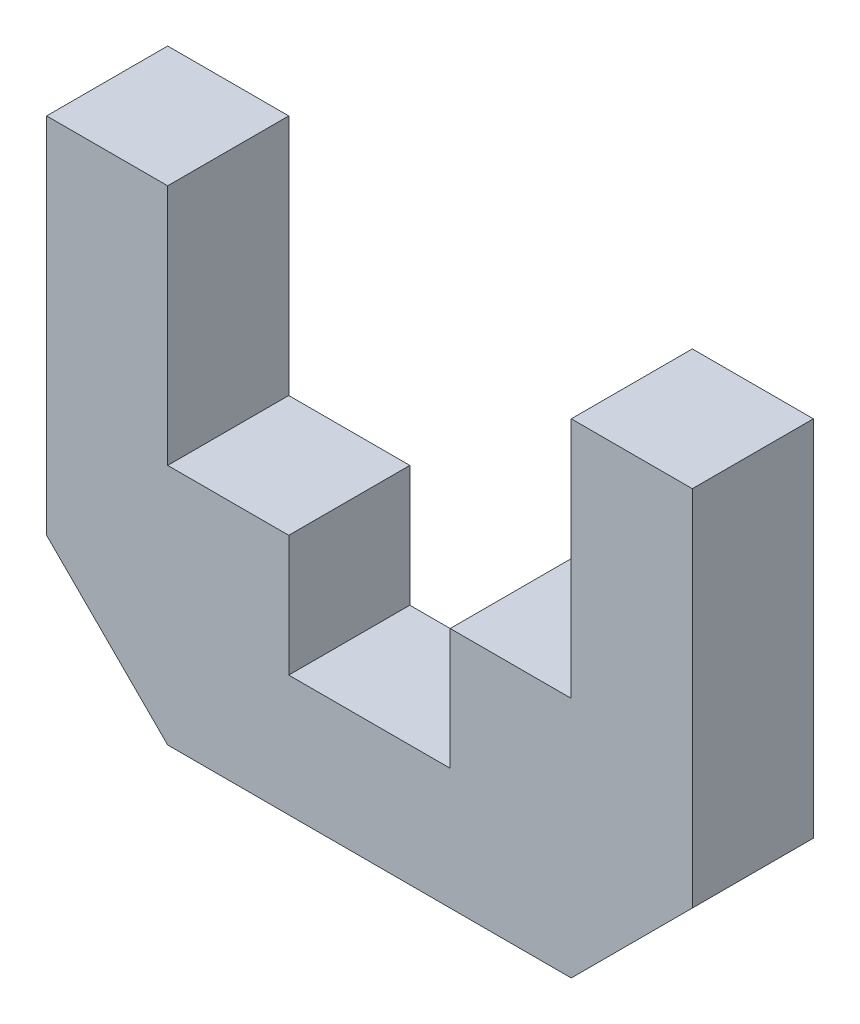
ISO-10303-21;
HEADER;
FILE_DESCRIPTION(('STEP AP214'),'2;1');
FILE_NAME('part.step','',(''),(''),'','','');
FILE_SCHEMA(('AUTOMOTIVE_DESIGN { 1 0 10303 214 1 1 1 1 }'));
ENDSEC;
DATA;
#1=APPLICATION_CONTEXT('core data for automotive mechanical design processes');
#2=APPLICATION_PROTOCOL_DEFINITION('international standard','automotive_design',2000,#1);
#3=PRODUCT_CONTEXT('',#1,'mechanical');
#4=PRODUCT('Part','Part','',(#3));
#5=PRODUCT_RELATED_PRODUCT_CATEGORY('part','',(#4));
#6=PRODUCT_DEFINITION_FORMATION('','',#4);
#7=PRODUCT_DEFINITION_CONTEXT('part definition',#1,'design');
#8=PRODUCT_DEFINITION('design','',#6,#7);
#9=PRODUCT_DEFINITION_SHAPE('','',#8);
#10=(LENGTH_UNIT() NAMED_UNIT(*) SI_UNIT(.MILLI.,.METRE.));
#11=(NAMED_UNIT(*) PLANE_ANGLE_UNIT() SI_UNIT($,.RADIAN.));
#12=(NAMED_UNIT(*) SI_UNIT($,.STERADIAN.) SOLID_ANGLE_UNIT());
#13=UNCERTAINTY_MEASURE_WITH_UNIT(LENGTH_MEASURE(1.E-05),#10,'distance_accuracy_value','');
#14=(GEOMETRIC_REPRESENTATION_CONTEXT(3) GLOBAL_UNCERTAINTY_ASSIGNED_CONTEXT((#13)) GLOBAL_UNIT_ASSIGNED_CONTEXT((#10,
#11,#12)) REPRESENTATION_CONTEXT('',''));
#15=CARTESIAN_POINT('',(0.,0.,0.));
#16=DIRECTION('',(0.,0.,1.));
#17=DIRECTION('',(1.,0.,0.));
#18=AXIS2_PLACEMENT_3D('',#15,#16,#17);
#19=CARTESIAN_POINT('',(-2.,3.,3.));
#20=DIRECTION('',(0.,-1.,0.));
#21=DIRECTION('',(0.,0.,-1.));
#22=AXIS2_PLACEMENT_3D('',#19,#20,#21);
#23=PLANE('',#22);
#24=DIRECTION('',(-1.,0.,0.));
#25=VECTOR('',#24,1.);
#26=CARTESIAN_POINT('',(-2.,3.,0.));
#27=LINE('',#26,#25);
#28=CARTESIAN_POINT('',(-2.,3.,0.));
#29=VERTEX_POINT('',#28);
#30=CARTESIAN_POINT('',(-5.,3.,0.));
#31=VERTEX_POINT('',#30);
#32=EDGE_CURVE('E171',#29,#31,#27,.T.);
#33=ORIENTED_EDGE('',*,*,#32,.T.);
#34=DIRECTION('',(0.,0.,-1.));
#35=VECTOR('',#34,1.);
#36=CARTESIAN_POINT('',(-5.,3.,3.));
#37=LINE('',#36,#35);
#38=CARTESIAN_POINT('',(-5.,3.,3.));
#39=VERTEX_POINT('',#38);
#40=EDGE_CURVE('E11',#39,#31,#37,.T.);
#41=ORIENTED_EDGE('',*,*,#40,.F.);
#42=DIRECTION('',(-1.,0.,0.));
#43=VECTOR('',#42,1.);
#44=CARTESIAN_POINT('',(-2.,3.,3.));
#45=LINE('',#44,#43);
#46=CARTESIAN_POINT('',(-2.,3.,3.));
#47=VERTEX_POINT('',#46);
#48=EDGE_CURVE('E197',#47,#39,#45,.T.);
#49=ORIENTED_EDGE('',*,*,#48,.F.);
#50=DIRECTION('',(0.,0.,-1.));
#51=VECTOR('',#50,1.);
#52=CARTESIAN_POINT('',(-2.,3.,3.));
#53=LINE('',#52,#51);
#54=EDGE_CURVE('E167',#47,#29,#53,.T.);
#55=ORIENTED_EDGE('',*,*,#54,.T.);
#56=EDGE_LOOP('',(#33,#41,#49,#55));
#57=FACE_BOUND('',#56,.T.);
#58=ADVANCED_FACE('F39',(#57),#23,.F.);
#59=CARTESIAN_POINT('',(-5.,3.,3.));
#60=DIRECTION('',(-1.,0.,0.));
#61=DIRECTION('',(0.,0.,1.));
#62=AXIS2_PLACEMENT_3D('',#59,#60,#61);
#63=PLANE('',#62);
#64=DIRECTION('',(0.,1.,0.));
#65=VECTOR('',#64,1.);
#66=CARTESIAN_POINT('',(-5.,3.,0.));
#67=LINE('',#66,#65);
#68=CARTESIAN_POINT('',(-5.,9.,0.));
#69=VERTEX_POINT('',#68);
#70=EDGE_CURVE('E174',#31,#69,#67,.T.);
#71=ORIENTED_EDGE('',*,*,#70,.T.);
#72=DIRECTION('',(0.,0.,-1.));
#73=VECTOR('',#72,1.);
#74=CARTESIAN_POINT('',(-5.,9.,3.));
#75=LINE('',#74,#73);
#76=CARTESIAN_POINT('',(-5.,9.,3.));
#77=VERTEX_POINT('',#76);
#78=EDGE_CURVE('E47',#77,#69,#75,.T.);
#79=ORIENTED_EDGE('',*,*,#78,.F.);
#80=DIRECTION('',(0.,1.,0.));
#81=VECTOR('',#80,1.);
#82=CARTESIAN_POINT('',(-5.,3.,3.));
#83=LINE('',#82,#81);
#84=EDGE_CURVE('E116',#39,#77,#83,.T.);
#85=ORIENTED_EDGE('',*,*,#84,.F.);
#86=ORIENTED_EDGE('',*,*,#40,.T.);
#87=EDGE_LOOP('',(#71,#79,#85,#86));
#88=FACE_BOUND('',#87,.T.);
#89=ADVANCED_FACE('F285',(#88),#63,.F.);
#90=CARTESIAN_POINT('',(-5.,9.,3.));
#91=DIRECTION('',(0.,-1.,0.));
#92=DIRECTION('',(0.,0.,-1.));
#93=AXIS2_PLACEMENT_3D('',#90,#91,#92);
#94=PLANE('',#93);
#95=DIRECTION('',(-1.,0.,0.));
#96=VECTOR('',#95,1.);
#97=CARTESIAN_POINT('',(-5.,9.,0.));
#98=LINE('',#97,#96);
#99=CARTESIAN_POINT('',(-8.,9.,0.));
#100=VERTEX_POINT('',#99);
#101=EDGE_CURVE('E176',#69,#100,#98,.T.);
#102=ORIENTED_EDGE('',*,*,#101,.T.);
#103=DIRECTION('',(0.,0.,-1.));
#104=VECTOR('',#103,1.);
#105=CARTESIAN_POINT('',(-8.,9.,3.));
#106=LINE('',#105,#104);
#107=CARTESIAN_POINT('',(-8.,9.,3.));
#108=VERTEX_POINT('',#107);
#109=EDGE_CURVE('E222',#108,#100,#106,.T.);
#110=ORIENTED_EDGE('',*,*,#109,.F.);
#111=DIRECTION('',(-1.,0.,0.));
#112=VECTOR('',#111,1.);
#113=CARTESIAN_POINT('',(-5.,9.,3.));
#114=LINE('',#113,#112);
#115=EDGE_CURVE('E230',#77,#108,#114,.T.);
#116=ORIENTED_EDGE('',*,*,#115,.F.);
#117=ORIENTED_EDGE('',*,*,#78,.T.);
#118=EDGE_LOOP('',(#102,#110,#116,#117));
#119=FACE_BOUND('',#118,.T.);
#120=ADVANCED_FACE('F228',(#119),#94,.F.);
#121=CARTESIAN_POINT('',(-8.,9.,3.));
#122=DIRECTION('',(1.,0.,0.));
#123=DIRECTION('',(0.,0.,-1.));
#124=AXIS2_PLACEMENT_3D('',#121,#122,#123);
#125=PLANE('',#124);
#126=DIRECTION('',(0.,-1.,0.));
#127=VECTOR('',#126,1.);
#128=CARTESIAN_POINT('',(-8.,9.,0.));
#129=LINE('',#128,#127);
#130=CARTESIAN_POINT('',(-8.,0.,0.));
#131=VERTEX_POINT('',#130);
#132=EDGE_CURVE('E178',#100,#131,#129,.T.);
#133=ORIENTED_EDGE('',*,*,#132,.T.);
#134=DIRECTION('',(0.,0.,-1.));
#135=VECTOR('',#134,1.);
#136=CARTESIAN_POINT('',(-8.,0.,3.));
#137=LINE('',#136,#135);
#138=CARTESIAN_POINT('',(-8.,0.,3.));
#139=VERTEX_POINT('',#138);
#140=EDGE_CURVE('E219',#139,#131,#137,.T.);
#141=ORIENTED_EDGE('',*,*,#140,.F.);
#142=DIRECTION('',(0.,-1.,0.));
#143=VECTOR('',#142,1.);
#144=CARTESIAN_POINT('',(-8.,9.,3.));
#145=LINE('',#144,#143);
#146=EDGE_CURVE('E248',#108,#139,#145,.T.);
#147=ORIENTED_EDGE('',*,*,#146,.F.);
#148=ORIENTED_EDGE('',*,*,#109,.T.);
#149=EDGE_LOOP('',(#133,#141,#147,#148));
#150=FACE_BOUND('',#149,.T.);
#151=ADVANCED_FACE('F239',(#150),#125,.F.);
#152=CARTESIAN_POINT('',(-5.,-3.,3.));
#153=DIRECTION('',(0.707106781186547,0.707106781186548,0.));
#154=DIRECTION('',(-0.707106781186548,0.707106781186547,0.));
#155=AXIS2_PLACEMENT_3D('',#152,#153,#154);
#156=PLANE('',#155);
#157=DIRECTION('',(0.707106781186548,-0.707106781186547,0.));
#158=VECTOR('',#157,1.);
#159=CARTESIAN_POINT('',(-5.,-3.,0.));
#160=LINE('',#159,#158);
#161=CARTESIAN_POINT('',(-5.,-3.,0.));
#162=VERTEX_POINT('',#161);
#163=EDGE_CURVE('E180',#131,#162,#160,.T.);
#164=ORIENTED_EDGE('',*,*,#163,.T.);
#165=DIRECTION('',(0.,0.,-1.));
#166=VECTOR('',#165,1.);
#167=CARTESIAN_POINT('',(-5.,-3.,3.));
#168=LINE('',#167,#166);
#169=CARTESIAN_POINT('',(-5.,-3.,3.));
#170=VERTEX_POINT('',#169);
#171=EDGE_CURVE('E216',#170,#162,#168,.T.);
#172=ORIENTED_EDGE('',*,*,#171,.F.);
#173=DIRECTION('',(0.707106781186548,-0.707106781186547,0.));
#174=VECTOR('',#173,1.);
#175=CARTESIAN_POINT('',(-5.,-3.,3.));
#176=LINE('',#175,#174);
#177=EDGE_CURVE('E245',#139,#170,#176,.T.);
#178=ORIENTED_EDGE('',*,*,#177,.F.);
#179=ORIENTED_EDGE('',*,*,#140,.T.);
#180=EDGE_LOOP('',(#164,#172,#178,#179));
#181=FACE_BOUND('',#180,.T.);
#182=ADVANCED_FACE('F243',(#181),#156,.F.);
#183=CARTESIAN_POINT('',(5.,-3.,3.));
#184=DIRECTION('',(0.,1.,0.));
#185=DIRECTION('',(0.,0.,1.));
#186=AXIS2_PLACEMENT_3D('',#183,#184,#185);
#187=PLANE('',#186);
#188=DIRECTION('',(1.,0.,0.));
#189=VECTOR('',#188,1.);
#190=CARTESIAN_POINT('',(5.,-3.,0.));
#191=LINE('',#190,#189);
#192=CARTESIAN_POINT('',(5.,-3.,0.));
#193=VERTEX_POINT('',#192);
#194=EDGE_CURVE('E182',#162,#193,#191,.T.);
#195=ORIENTED_EDGE('',*,*,#194,.T.);
#196=DIRECTION('',(0.,0.,-1.));
#197=VECTOR('',#196,1.);
#198=CARTESIAN_POINT('',(5.,-3.,3.));
#199=LINE('',#198,#197);
#200=CARTESIAN_POINT('',(5.,-3.,3.));
#201=VERTEX_POINT('',#200);
#202=EDGE_CURVE('E213',#201,#193,#199,.T.);
#203=ORIENTED_EDGE('',*,*,#202,.F.);
#204=DIRECTION('',(1.,0.,0.));
#205=VECTOR('',#204,1.);
#206=CARTESIAN_POINT('',(5.,-3.,3.));
#207=LINE('',#206,#205);
#208=EDGE_CURVE('E247',#170,#201,#207,.T.);
#209=ORIENTED_EDGE('',*,*,#208,.F.);
#210=ORIENTED_EDGE('',*,*,#171,.T.);
#211=EDGE_LOOP('',(#195,#203,#209,#210));
#212=FACE_BOUND('',#211,.T.);
#213=ADVANCED_FACE('F298',(#212),#187,.F.);
#214=CARTESIAN_POINT('',(5.,-3.,3.));
#215=DIRECTION('',(-0.707106781186547,0.707106781186548,0.));
#216=DIRECTION('',(-0.707106781186548,-0.707106781186547,0.));
#217=AXIS2_PLACEMENT_3D('',#214,#215,#216);
#218=PLANE('',#217);
#219=DIRECTION('',(0.707106781186548,0.707106781186547,0.));
#220=VECTOR('',#219,1.);
#221=CARTESIAN_POINT('',(5.,-3.,0.));
#222=LINE('',#221,#220);
#223=CARTESIAN_POINT('',(8.,0.,0.));
#224=VERTEX_POINT('',#223);
#225=EDGE_CURVE('E184',#193,#224,#222,.T.);
#226=ORIENTED_EDGE('',*,*,#225,.T.);
#227=DIRECTION('',(0.,0.,-1.));
#228=VECTOR('',#227,1.);
#229=CARTESIAN_POINT('',(8.,0.,3.));
#230=LINE('',#229,#228);
#231=CARTESIAN_POINT('',(8.,0.,3.));
#232=VERTEX_POINT('',#231);
#233=EDGE_CURVE('E210',#232,#224,#230,.T.);
#234=ORIENTED_EDGE('',*,*,#233,.F.);
#235=DIRECTION('',(0.707106781186548,0.707106781186547,0.));
#236=VECTOR('',#235,1.);
#237=CARTESIAN_POINT('',(5.,-3.,3.));
#238=LINE('',#237,#236);
#239=EDGE_CURVE('E250',#201,#232,#238,.T.);
#240=ORIENTED_EDGE('',*,*,#239,.F.);
#241=ORIENTED_EDGE('',*,*,#202,.T.);
#242=EDGE_LOOP('',(#226,#234,#240,#241));
#243=FACE_BOUND('',#242,.T.);
#244=ADVANCED_FACE('F301',(#243),#218,.F.);
#245=CARTESIAN_POINT('',(8.,9.,3.));
#246=DIRECTION('',(-1.,0.,0.));
#247=DIRECTION('',(0.,0.,1.));
#248=AXIS2_PLACEMENT_3D('',#245,#246,#247);
#249=PLANE('',#248);
#250=DIRECTION('',(0.,1.,0.));
#251=VECTOR('',#250,1.);
#252=CARTESIAN_POINT('',(8.,9.,0.));
#253=LINE('',#252,#251);
#254=CARTESIAN_POINT('',(8.,9.,0.));
#255=VERTEX_POINT('',#254);
#256=EDGE_CURVE('E186',#224,#255,#253,.T.);
#257=ORIENTED_EDGE('',*,*,#256,.T.);
#258=DIRECTION('',(0.,0.,-1.));
#259=VECTOR('',#258,1.);
#260=CARTESIAN_POINT('',(8.,9.,3.));
#261=LINE('',#260,#259);
#262=CARTESIAN_POINT('',(8.,9.,3.));
#263=VERTEX_POINT('',#262);
#264=EDGE_CURVE('E207',#263,#255,#261,.T.);
#265=ORIENTED_EDGE('',*,*,#264,.F.);
#266=DIRECTION('',(0.,1.,0.));
#267=VECTOR('',#266,1.);
#268=CARTESIAN_POINT('',(8.,9.,3.));
#269=LINE('',#268,#267);
#270=EDGE_CURVE('E256',#232,#263,#269,.T.);
#271=ORIENTED_EDGE('',*,*,#270,.F.);
#272=ORIENTED_EDGE('',*,*,#233,.T.);
#273=EDGE_LOOP('',(#257,#265,#271,#272));
#274=FACE_BOUND('',#273,.T.);
#275=ADVANCED_FACE('F305',(#274),#249,.F.);
#276=CARTESIAN_POINT('',(5.,9.,3.));
#277=DIRECTION('',(0.,-1.,0.));
#278=DIRECTION('',(0.,0.,-1.));
#279=AXIS2_PLACEMENT_3D('',#276,#277,#278);
#280=PLANE('',#279);
#281=DIRECTION('',(-1.,0.,0.));
#282=VECTOR('',#281,1.);
#283=CARTESIAN_POINT('',(5.,9.,0.));
#284=LINE('',#283,#282);
#285=CARTESIAN_POINT('',(5.,9.,0.));
#286=VERTEX_POINT('',#285);
#287=EDGE_CURVE('E188',#255,#286,#284,.T.);
#288=ORIENTED_EDGE('',*,*,#287,.T.);
#289=DIRECTION('',(0.,0.,-1.));
#290=VECTOR('',#289,1.);
#291=CARTESIAN_POINT('',(5.,9.,3.));
#292=LINE('',#291,#290);
#293=CARTESIAN_POINT('',(5.,9.,3.));
#294=VERTEX_POINT('',#293);
#295=EDGE_CURVE('E204',#294,#286,#292,.T.);
#296=ORIENTED_EDGE('',*,*,#295,.F.);
#297=DIRECTION('',(-1.,0.,0.));
#298=VECTOR('',#297,1.);
#299=CARTESIAN_POINT('',(5.,9.,3.));
#300=LINE('',#299,#298);
#301=EDGE_CURVE('E258',#263,#294,#300,.T.);
#302=ORIENTED_EDGE('',*,*,#301,.F.);
#303=ORIENTED_EDGE('',*,*,#264,.T.);
#304=EDGE_LOOP('',(#288,#296,#302,#303));
#305=FACE_BOUND('',#304,.T.);
#306=ADVANCED_FACE('F309',(#305),#280,.F.);
#307=CARTESIAN_POINT('',(5.,3.,3.));
#308=DIRECTION('',(1.,0.,0.));
#309=DIRECTION('',(0.,0.,-1.));
#310=AXIS2_PLACEMENT_3D('',#307,#308,#309);
#311=PLANE('',#310);
#312=DIRECTION('',(0.,-1.,0.));
#313=VECTOR('',#312,1.);
#314=CARTESIAN_POINT('',(5.,3.,0.));
#315=LINE('',#314,#313);
#316=CARTESIAN_POINT('',(5.,3.,0.));
#317=VERTEX_POINT('',#316);
#318=EDGE_CURVE('E190',#286,#317,#315,.T.);
#319=ORIENTED_EDGE('',*,*,#318,.T.);
#320=DIRECTION('',(0.,0.,-1.));
#321=VECTOR('',#320,1.);
#322=CARTESIAN_POINT('',(5.,3.,3.));
#323=LINE('',#322,#321);
#324=CARTESIAN_POINT('',(5.,3.,3.));
#325=VERTEX_POINT('',#324);
#326=EDGE_CURVE('E201',#325,#317,#323,.T.);
#327=ORIENTED_EDGE('',*,*,#326,.F.);
#328=DIRECTION('',(0.,-1.,0.));
#329=VECTOR('',#328,1.);
#330=CARTESIAN_POINT('',(5.,3.,3.));
#331=LINE('',#330,#329);
#332=EDGE_CURVE('E260',#294,#325,#331,.T.);
#333=ORIENTED_EDGE('',*,*,#332,.F.);
#334=ORIENTED_EDGE('',*,*,#295,.T.);
#335=EDGE_LOOP('',(#319,#327,#333,#334));
#336=FACE_BOUND('',#335,.T.);
#337=ADVANCED_FACE('F266',(#336),#311,.F.);
#338=CARTESIAN_POINT('',(2.,3.,3.));
#339=DIRECTION('',(0.,-1.,0.));
#340=DIRECTION('',(0.,0.,-1.));
#341=AXIS2_PLACEMENT_3D('',#338,#339,#340);
#342=PLANE('',#341);
#343=DIRECTION('',(-1.,0.,0.));
#344=VECTOR('',#343,1.);
#345=CARTESIAN_POINT('',(2.,3.,0.));
#346=LINE('',#345,#344);
#347=CARTESIAN_POINT('',(2.,3.,0.));
#348=VERTEX_POINT('',#347);
#349=EDGE_CURVE('E192',#317,#348,#346,.T.);
#350=ORIENTED_EDGE('',*,*,#349,.T.);
#351=DIRECTION('',(0.,0.,-1.));
#352=VECTOR('',#351,1.);
#353=CARTESIAN_POINT('',(2.,3.,3.));
#354=LINE('',#353,#352);
#355=CARTESIAN_POINT('',(2.,3.,3.));
#356=VERTEX_POINT('',#355);
#357=EDGE_CURVE('E162',#356,#348,#354,.T.);
#358=ORIENTED_EDGE('',*,*,#357,.F.);
#359=DIRECTION('',(-1.,0.,0.));
#360=VECTOR('',#359,1.);
#361=CARTESIAN_POINT('',(2.,3.,3.));
#362=LINE('',#361,#360);
#363=EDGE_CURVE('E153',#325,#356,#362,.T.);
#364=ORIENTED_EDGE('',*,*,#363,.F.);
#365=ORIENTED_EDGE('',*,*,#326,.T.);
#366=EDGE_LOOP('',(#350,#358,#364,#365));
#367=FACE_BOUND('',#366,.T.);
#368=ADVANCED_FACE('F270',(#367),#342,.F.);
#369=CARTESIAN_POINT('',(2.,0.,3.));
#370=DIRECTION('',(1.,0.,0.));
#371=DIRECTION('',(0.,0.,-1.));
#372=AXIS2_PLACEMENT_3D('',#369,#370,#371);
#373=PLANE('',#372);
#374=DIRECTION('',(0.,-1.,0.));
#375=VECTOR('',#374,1.);
#376=CARTESIAN_POINT('',(2.,0.,0.));
#377=LINE('',#376,#375);
#378=CARTESIAN_POINT('',(2.,0.,0.));
#379=VERTEX_POINT('',#378);
#380=EDGE_CURVE('E161',#348,#379,#377,.T.);
#381=ORIENTED_EDGE('',*,*,#380,.T.);
#382=DIRECTION('',(0.,0.,-1.));
#383=VECTOR('',#382,1.);
#384=CARTESIAN_POINT('',(2.,0.,3.));
#385=LINE('',#384,#383);
#386=CARTESIAN_POINT('',(2.,0.,3.));
#387=VERTEX_POINT('',#386);
#388=EDGE_CURVE('E158',#387,#379,#385,.T.);
#389=ORIENTED_EDGE('',*,*,#388,.F.);
#390=DIRECTION('',(0.,-1.,0.));
#391=VECTOR('',#390,1.);
#392=CARTESIAN_POINT('',(2.,0.,3.));
#393=LINE('',#392,#391);
#394=EDGE_CURVE('E147',#356,#387,#393,.T.);
#395=ORIENTED_EDGE('',*,*,#394,.F.);
#396=ORIENTED_EDGE('',*,*,#357,.T.);
#397=EDGE_LOOP('',(#381,#389,#395,#396));
#398=FACE_BOUND('',#397,.T.);
#399=ADVANCED_FACE('F159',(#398),#373,.F.);
#400=CARTESIAN_POINT('',(2.,0.,3.));
#401=DIRECTION('',(0.,-1.,0.));
#402=DIRECTION('',(0.,0.,-1.));
#403=AXIS2_PLACEMENT_3D('',#400,#401,#402);
#404=PLANE('',#403);
#405=DIRECTION('',(-1.,0.,0.));
#406=VECTOR('',#405,1.);
#407=CARTESIAN_POINT('',(2.,0.,0.));
#408=LINE('',#407,#406);
#409=CARTESIAN_POINT('',(-2.,0.,0.));
#410=VERTEX_POINT('',#409);
#411=EDGE_CURVE('E102',#379,#410,#408,.T.);
#412=ORIENTED_EDGE('',*,*,#411,.T.);
#413=DIRECTION('',(0.,0.,-1.));
#414=VECTOR('',#413,1.);
#415=CARTESIAN_POINT('',(-2.,0.,3.));
#416=LINE('',#415,#414);
#417=CARTESIAN_POINT('',(-2.,0.,3.));
#418=VERTEX_POINT('',#417);
#419=EDGE_CURVE('E163',#418,#410,#416,.T.);
#420=ORIENTED_EDGE('',*,*,#419,.F.);
#421=DIRECTION('',(-1.,0.,0.));
#422=VECTOR('',#421,1.);
#423=CARTESIAN_POINT('',(2.,0.,3.));
#424=LINE('',#423,#422);
#425=EDGE_CURVE('E151',#387,#418,#424,.T.);
#426=ORIENTED_EDGE('',*,*,#425,.F.);
#427=ORIENTED_EDGE('',*,*,#388,.T.);
#428=EDGE_LOOP('',(#412,#420,#426,#427));
#429=FACE_BOUND('',#428,.T.);
#430=ADVANCED_FACE('F165',(#429),#404,.F.);
#431=CARTESIAN_POINT('',(-2.,0.,3.));
#432=DIRECTION('',(-1.,0.,0.));
#433=DIRECTION('',(0.,0.,1.));
#434=AXIS2_PLACEMENT_3D('',#431,#432,#433);
#435=PLANE('',#434);
#436=DIRECTION('',(0.,1.,0.));
#437=VECTOR('',#436,1.);
#438=CARTESIAN_POINT('',(-2.,0.,0.));
#439=LINE('',#438,#437);
#440=EDGE_CURVE('E108',#410,#29,#439,.T.);
#441=ORIENTED_EDGE('',*,*,#440,.T.);
#442=ORIENTED_EDGE('',*,*,#54,.F.);
#443=DIRECTION('',(0.,1.,0.));
#444=VECTOR('',#443,1.);
#445=CARTESIAN_POINT('',(-2.,0.,3.));
#446=LINE('',#445,#444);
#447=EDGE_CURVE('E55',#418,#47,#446,.T.);
#448=ORIENTED_EDGE('',*,*,#447,.F.);
#449=ORIENTED_EDGE('',*,*,#419,.T.);
#450=EDGE_LOOP('',(#441,#442,#448,#449));
#451=FACE_BOUND('',#450,.T.);
#452=ADVANCED_FACE('F274',(#451),#435,.F.);
#453=CARTESIAN_POINT('',(0.,0.,3.));
#454=DIRECTION('',(0.,0.,-1.));
#455=DIRECTION('',(-1.,0.,0.));
#456=AXIS2_PLACEMENT_3D('',#453,#454,#455);
#457=PLANE('',#456);
#458=ORIENTED_EDGE('',*,*,#48,.T.);
#459=ORIENTED_EDGE('',*,*,#84,.T.);
#460=ORIENTED_EDGE('',*,*,#115,.T.);
#461=ORIENTED_EDGE('',*,*,#146,.T.);
#462=ORIENTED_EDGE('',*,*,#177,.T.);
#463=ORIENTED_EDGE('',*,*,#208,.T.);
#464=ORIENTED_EDGE('',*,*,#239,.T.);
#465=ORIENTED_EDGE('',*,*,#270,.T.);
#466=ORIENTED_EDGE('',*,*,#301,.T.);
#467=ORIENTED_EDGE('',*,*,#332,.T.);
#468=ORIENTED_EDGE('',*,*,#363,.T.);
#469=ORIENTED_EDGE('',*,*,#394,.T.);
#470=ORIENTED_EDGE('',*,*,#425,.T.);
#471=ORIENTED_EDGE('',*,*,#447,.T.);
#472=EDGE_LOOP('',(#458,#459,#460,#461,#462,#463,#464,#465,#466,#467,#468,#469,#470,#471));
#473=FACE_BOUND('',#472,.T.);
#474=ADVANCED_FACE('F149',(#473),#457,.F.);
#475=CARTESIAN_POINT('',(0.,0.,0.));
#476=DIRECTION('',(0.,0.,-1.));
#477=DIRECTION('',(-1.,0.,0.));
#478=AXIS2_PLACEMENT_3D('',#475,#476,#477);
#479=PLANE('',#478);
#480=ORIENTED_EDGE('',*,*,#32,.F.);
#481=ORIENTED_EDGE('',*,*,#440,.F.);
#482=ORIENTED_EDGE('',*,*,#411,.F.);
#483=ORIENTED_EDGE('',*,*,#380,.F.);
#484=ORIENTED_EDGE('',*,*,#349,.F.);
#485=ORIENTED_EDGE('',*,*,#318,.F.);
#486=ORIENTED_EDGE('',*,*,#287,.F.);
#487=ORIENTED_EDGE('',*,*,#256,.F.);
#488=ORIENTED_EDGE('',*,*,#225,.F.);
#489=ORIENTED_EDGE('',*,*,#194,.F.);
#490=ORIENTED_EDGE('',*,*,#163,.F.);
#491=ORIENTED_EDGE('',*,*,#132,.F.);
#492=ORIENTED_EDGE('',*,*,#101,.F.);
#493=ORIENTED_EDGE('',*,*,#70,.F.);
#494=EDGE_LOOP('',(#480,#481,#482,#483,#484,#485,#486,#487,#488,#489,#490,#491,#492,#493));
#495=FACE_BOUND('',#494,.T.);
#496=ADVANCED_FACE('F234',(#495),#479,.T.);
#497=CLOSED_SHELL('',(#58,#89,#120,#151,#182,#213,#244,#275,#306,#337,#368,#399,#430,#452,#474,#496));
#498=MANIFOLD_SOLID_BREP('B2',#497);
#499=ADVANCED_BREP_SHAPE_REPRESENTATION('',(#18,#498),#14);
#500=SHAPE_DEFINITION_REPRESENTATION(#9,#499);
ENDSEC;
END-ISO-10303-21;
